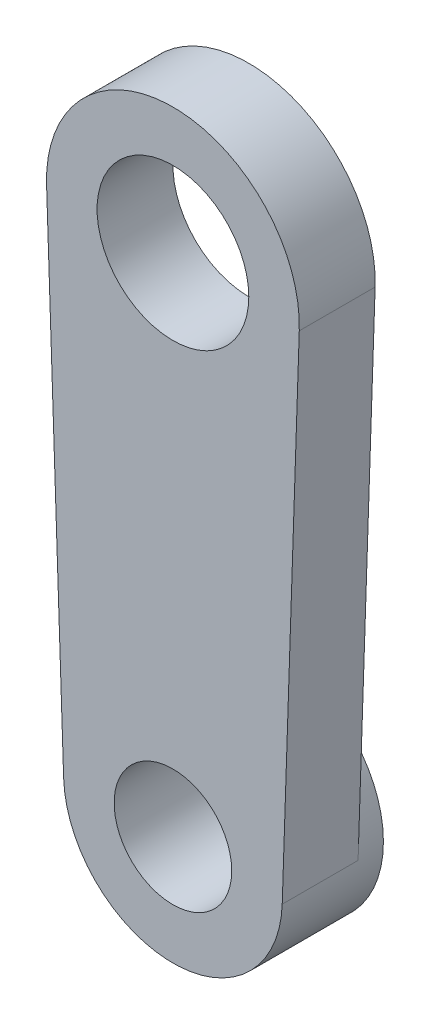
ISO-10303-21;
HEADER;
FILE_DESCRIPTION(('STEP AP214'),'2;1');
FILE_NAME('part.step','',(''),(''),'','','');
FILE_SCHEMA(('AUTOMOTIVE_DESIGN { 1 0 10303 214 1 1 1 1 }'));
ENDSEC;
DATA;
#1=APPLICATION_CONTEXT('core data for automotive mechanical design processes');
#2=APPLICATION_PROTOCOL_DEFINITION('international standard','automotive_design',2000,#1);
#3=PRODUCT_CONTEXT('',#1,'mechanical');
#4=PRODUCT('Part','Part','',(#3));
#5=PRODUCT_RELATED_PRODUCT_CATEGORY('part','',(#4));
#6=PRODUCT_DEFINITION_FORMATION('','',#4);
#7=PRODUCT_DEFINITION_CONTEXT('part definition',#1,'design');
#8=PRODUCT_DEFINITION('design','',#6,#7);
#9=PRODUCT_DEFINITION_SHAPE('','',#8);
#10=(LENGTH_UNIT() NAMED_UNIT(*) SI_UNIT(.MILLI.,.METRE.));
#11=(NAMED_UNIT(*) PLANE_ANGLE_UNIT() SI_UNIT($,.RADIAN.));
#12=(NAMED_UNIT(*) SI_UNIT($,.STERADIAN.) SOLID_ANGLE_UNIT());
#13=UNCERTAINTY_MEASURE_WITH_UNIT(LENGTH_MEASURE(1.E-05),#10,'distance_accuracy_value','');
#14=(GEOMETRIC_REPRESENTATION_CONTEXT(3) GLOBAL_UNCERTAINTY_ASSIGNED_CONTEXT((#13)) GLOBAL_UNIT_ASSIGNED_CONTEXT((#10,
#11,#12)) REPRESENTATION_CONTEXT('',''));
#15=CARTESIAN_POINT('',(0.,0.,0.));
#16=DIRECTION('',(0.,0.,1.));
#17=DIRECTION('',(1.,0.,0.));
#18=AXIS2_PLACEMENT_3D('',#15,#16,#17);
#19=CARTESIAN_POINT('',(0.,0.,3.));
#20=DIRECTION('',(0.,0.,-1.));
#21=DIRECTION('',(-1.,0.,0.));
#22=AXIS2_PLACEMENT_3D('',#19,#20,#21);
#23=CYLINDRICAL_SURFACE('',#22,4.325);
#24=DIRECTION('',(0.,0.,-1.));
#25=VECTOR('',#24,1.);
#26=CARTESIAN_POINT('',(-4.32253607550283,-0.14596875,3.));
#27=LINE('',#26,#25);
#28=CARTESIAN_POINT('',(-4.32253607550283,-0.14596875,3.));
#29=VERTEX_POINT('',#28);
#30=CARTESIAN_POINT('',(-4.32253607550283,-0.14596875,0.));
#31=VERTEX_POINT('',#30);
#32=EDGE_CURVE('E100',#29,#31,#27,.T.);
#33=ORIENTED_EDGE('',*,*,#32,.T.);
#34=CARTESIAN_POINT('',(0.,0.,0.));
#35=DIRECTION('',(0.,0.,1.));
#36=DIRECTION('',(1.,0.,0.));
#37=AXIS2_PLACEMENT_3D('',#34,#35,#36);
#38=CIRCLE('',#37,4.325);
#39=CARTESIAN_POINT('',(4.32253607550283,-0.14596875,0.));
#40=VERTEX_POINT('',#39);
#41=EDGE_CURVE('E11',#40,#31,#38,.T.);
#42=ORIENTED_EDGE('',*,*,#41,.F.);
#43=DIRECTION('',(0.,0.,-1.));
#44=VECTOR('',#43,1.);
#45=CARTESIAN_POINT('',(4.32253607550283,-0.14596875,3.));
#46=LINE('',#45,#44);
#47=CARTESIAN_POINT('',(4.32253607550283,-0.14596875,3.));
#48=VERTEX_POINT('',#47);
#49=EDGE_CURVE('E51',#48,#40,#46,.T.);
#50=ORIENTED_EDGE('',*,*,#49,.F.);
#51=CARTESIAN_POINT('',(0.,0.,3.));
#52=DIRECTION('',(0.,0.,1.));
#53=DIRECTION('',(1.,0.,0.));
#54=AXIS2_PLACEMENT_3D('',#51,#52,#53);
#55=CIRCLE('',#54,4.325);
#56=EDGE_CURVE('E91',#29,#48,#55,.T.);
#57=ORIENTED_EDGE('',*,*,#56,.F.);
#58=EDGE_LOOP('',(#33,#42,#50,#57));
#59=FACE_BOUND('',#58,.T.);
#60=CARTESIAN_POINT('',(0.,0.,-1.));
#61=DIRECTION('',(0.,0.,1.));
#62=DIRECTION('',(1.,0.,0.));
#63=AXIS2_PLACEMENT_3D('',#60,#61,#62);
#64=CIRCLE('',#63,4.325);
#65=CARTESIAN_POINT('',(4.325,0.,-1.));
#66=VERTEX_POINT('',#65);
#67=EDGE_CURVE('E117',#66,#66,#64,.T.);
#68=ORIENTED_EDGE('',*,*,#67,.T.);
#69=EDGE_LOOP('',(#68));
#70=FACE_BOUND('',#69,.T.);
#71=ADVANCED_FACE('F47',(#59,#70),#23,.T.);
#72=CARTESIAN_POINT('',(4.32253607550283,-0.14596875,3.));
#73=DIRECTION('',(0.999430306474644,-0.03375,0.));
#74=DIRECTION('',(0.03375,0.999430306474644,0.));
#75=AXIS2_PLACEMENT_3D('',#72,#73,#74);
#76=PLANE('',#75);
#77=DIRECTION('',(-0.03375,-0.999430306474644,0.));
#78=VECTOR('',#77,1.);
#79=CARTESIAN_POINT('',(4.32253607550283,-0.14596875,0.));
#80=LINE('',#79,#78);
#81=CARTESIAN_POINT('',(4.99715153237322,19.83125,0.));
#82=VERTEX_POINT('',#81);
#83=EDGE_CURVE('E104',#82,#40,#80,.T.);
#84=ORIENTED_EDGE('',*,*,#83,.F.);
#85=DIRECTION('',(0.,0.,-1.));
#86=VECTOR('',#85,1.);
#87=CARTESIAN_POINT('',(4.99715153237322,19.83125,3.));
#88=LINE('',#87,#86);
#89=CARTESIAN_POINT('',(4.99715153237322,19.83125,3.));
#90=VERTEX_POINT('',#89);
#91=EDGE_CURVE('E107',#90,#82,#88,.T.);
#92=ORIENTED_EDGE('',*,*,#91,.F.);
#93=DIRECTION('',(-0.03375,-0.999430306474644,0.));
#94=VECTOR('',#93,1.);
#95=CARTESIAN_POINT('',(4.32253607550283,-0.14596875,3.));
#96=LINE('',#95,#94);
#97=EDGE_CURVE('E105',#90,#48,#96,.T.);
#98=ORIENTED_EDGE('',*,*,#97,.T.);
#99=ORIENTED_EDGE('',*,*,#49,.T.);
#100=EDGE_LOOP('',(#84,#92,#98,#99));
#101=FACE_BOUND('',#100,.T.);
#102=ADVANCED_FACE('F103',(#101),#76,.T.);
#103=CARTESIAN_POINT('',(0.,20.,3.));
#104=DIRECTION('',(0.,0.,-1.));
#105=DIRECTION('',(-1.,0.,0.));
#106=AXIS2_PLACEMENT_3D('',#103,#104,#105);
#107=CYLINDRICAL_SURFACE('',#106,5.);
#108=CARTESIAN_POINT('',(0.,20.,0.));
#109=DIRECTION('',(0.,0.,1.));
#110=DIRECTION('',(1.,0.,0.));
#111=AXIS2_PLACEMENT_3D('',#108,#109,#110);
#112=CIRCLE('',#111,5.);
#113=CARTESIAN_POINT('',(-4.99715153237322,19.83125,0.));
#114=VERTEX_POINT('',#113);
#115=EDGE_CURVE('E80',#82,#114,#112,.T.);
#116=ORIENTED_EDGE('',*,*,#115,.T.);
#117=DIRECTION('',(0.,0.,-1.));
#118=VECTOR('',#117,1.);
#119=CARTESIAN_POINT('',(-4.99715153237322,19.83125,3.));
#120=LINE('',#119,#118);
#121=CARTESIAN_POINT('',(-4.99715153237322,19.83125,3.));
#122=VERTEX_POINT('',#121);
#123=EDGE_CURVE('E126',#122,#114,#120,.T.);
#124=ORIENTED_EDGE('',*,*,#123,.F.);
#125=CARTESIAN_POINT('',(0.,20.,3.));
#126=DIRECTION('',(0.,0.,1.));
#127=DIRECTION('',(1.,0.,0.));
#128=AXIS2_PLACEMENT_3D('',#125,#126,#127);
#129=CIRCLE('',#128,5.);
#130=EDGE_CURVE('E131',#90,#122,#129,.T.);
#131=ORIENTED_EDGE('',*,*,#130,.F.);
#132=ORIENTED_EDGE('',*,*,#91,.T.);
#133=EDGE_LOOP('',(#116,#124,#131,#132));
#134=FACE_BOUND('',#133,.T.);
#135=ADVANCED_FACE('F130',(#134),#107,.T.);
#136=CARTESIAN_POINT('',(0.,0.,3.));
#137=DIRECTION('',(0.,0.,-1.));
#138=DIRECTION('',(-1.,0.,0.));
#139=AXIS2_PLACEMENT_3D('',#136,#137,#138);
#140=CYLINDRICAL_SURFACE('',#139,2.325);
#141=CARTESIAN_POINT('',(0.,0.,3.));
#142=DIRECTION('',(0.,0.,1.));
#143=DIRECTION('',(1.,0.,0.));
#144=AXIS2_PLACEMENT_3D('',#141,#142,#143);
#145=CIRCLE('',#144,2.325);
#146=CARTESIAN_POINT('',(2.325,0.,3.));
#147=VERTEX_POINT('',#146);
#148=EDGE_CURVE('E138',#147,#147,#145,.T.);
#149=ORIENTED_EDGE('',*,*,#148,.T.);
#150=EDGE_LOOP('',(#149));
#151=FACE_BOUND('',#150,.T.);
#152=CARTESIAN_POINT('',(0.,0.,-1.));
#153=DIRECTION('',(0.,0.,1.));
#154=DIRECTION('',(1.,0.,0.));
#155=AXIS2_PLACEMENT_3D('',#152,#153,#154);
#156=CIRCLE('',#155,2.325);
#157=CARTESIAN_POINT('',(2.325,0.,-1.));
#158=VERTEX_POINT('',#157);
#159=EDGE_CURVE('E151',#158,#158,#156,.T.);
#160=ORIENTED_EDGE('',*,*,#159,.F.);
#161=EDGE_LOOP('',(#160));
#162=FACE_BOUND('',#161,.T.);
#163=ADVANCED_FACE('F159',(#151,#162),#140,.F.);
#164=CARTESIAN_POINT('',(0.,20.,3.));
#165=DIRECTION('',(0.,0.,-1.));
#166=DIRECTION('',(-1.,0.,0.));
#167=AXIS2_PLACEMENT_3D('',#164,#165,#166);
#168=CYLINDRICAL_SURFACE('',#167,3.);
#169=CARTESIAN_POINT('',(0.,20.,3.));
#170=DIRECTION('',(0.,0.,1.));
#171=DIRECTION('',(1.,0.,0.));
#172=AXIS2_PLACEMENT_3D('',#169,#170,#171);
#173=CIRCLE('',#172,3.);
#174=CARTESIAN_POINT('',(3.,20.,3.));
#175=VERTEX_POINT('',#174);
#176=EDGE_CURVE('E123',#175,#175,#173,.T.);
#177=ORIENTED_EDGE('',*,*,#176,.T.);
#178=EDGE_LOOP('',(#177));
#179=FACE_BOUND('',#178,.T.);
#180=CARTESIAN_POINT('',(0.,20.,0.));
#181=DIRECTION('',(0.,0.,1.));
#182=DIRECTION('',(1.,0.,0.));
#183=AXIS2_PLACEMENT_3D('',#180,#181,#182);
#184=CIRCLE('',#183,3.);
#185=CARTESIAN_POINT('',(3.,20.,0.));
#186=VERTEX_POINT('',#185);
#187=EDGE_CURVE('E110',#186,#186,#184,.T.);
#188=ORIENTED_EDGE('',*,*,#187,.F.);
#189=EDGE_LOOP('',(#188));
#190=FACE_BOUND('',#189,.T.);
#191=ADVANCED_FACE('F49',(#179,#190),#168,.F.);
#192=CARTESIAN_POINT('',(-4.32253607550283,-0.14596875,3.));
#193=DIRECTION('',(0.999430306474644,0.03375,0.));
#194=DIRECTION('',(-0.03375,0.999430306474644,0.));
#195=AXIS2_PLACEMENT_3D('',#192,#193,#194);
#196=PLANE('',#195);
#197=DIRECTION('',(0.03375,-0.999430306474644,0.));
#198=VECTOR('',#197,1.);
#199=CARTESIAN_POINT('',(-4.32253607550283,-0.14596875,0.));
#200=LINE('',#199,#198);
#201=EDGE_CURVE('E114',#114,#31,#200,.T.);
#202=ORIENTED_EDGE('',*,*,#201,.T.);
#203=ORIENTED_EDGE('',*,*,#32,.F.);
#204=DIRECTION('',(0.03375,-0.999430306474644,0.));
#205=VECTOR('',#204,1.);
#206=CARTESIAN_POINT('',(-4.32253607550283,-0.14596875,3.));
#207=LINE('',#206,#205);
#208=EDGE_CURVE('E66',#122,#29,#207,.T.);
#209=ORIENTED_EDGE('',*,*,#208,.F.);
#210=ORIENTED_EDGE('',*,*,#123,.T.);
#211=EDGE_LOOP('',(#202,#203,#209,#210));
#212=FACE_BOUND('',#211,.T.);
#213=ADVANCED_FACE('F167',(#212),#196,.F.);
#214=CARTESIAN_POINT('',(0.,0.,3.));
#215=DIRECTION('',(0.,0.,1.));
#216=DIRECTION('',(1.,0.,0.));
#217=AXIS2_PLACEMENT_3D('',#214,#215,#216);
#218=PLANE('',#217);
#219=ORIENTED_EDGE('',*,*,#176,.F.);
#220=EDGE_LOOP('',(#219));
#221=FACE_BOUND('',#220,.T.);
#222=ORIENTED_EDGE('',*,*,#148,.F.);
#223=EDGE_LOOP('',(#222));
#224=FACE_BOUND('',#223,.T.);
#225=ORIENTED_EDGE('',*,*,#56,.T.);
#226=ORIENTED_EDGE('',*,*,#97,.F.);
#227=ORIENTED_EDGE('',*,*,#130,.T.);
#228=ORIENTED_EDGE('',*,*,#208,.T.);
#229=EDGE_LOOP('',(#225,#226,#227,#228));
#230=FACE_BOUND('',#229,.T.);
#231=ADVANCED_FACE('F134',(#221,#224,#230),#218,.T.);
#232=CARTESIAN_POINT('',(0.,0.,0.));
#233=DIRECTION('',(0.,0.,1.));
#234=DIRECTION('',(1.,0.,0.));
#235=AXIS2_PLACEMENT_3D('',#232,#233,#234);
#236=PLANE('',#235);
#237=ORIENTED_EDGE('',*,*,#187,.T.);
#238=EDGE_LOOP('',(#237));
#239=FACE_BOUND('',#238,.T.);
#240=ORIENTED_EDGE('',*,*,#83,.T.);
#241=ORIENTED_EDGE('',*,*,#41,.T.);
#242=ORIENTED_EDGE('',*,*,#201,.F.);
#243=ORIENTED_EDGE('',*,*,#115,.F.);
#244=EDGE_LOOP('',(#240,#241,#242,#243));
#245=FACE_BOUND('',#244,.T.);
#246=ADVANCED_FACE('F108',(#239,#245),#236,.F.);
#247=CARTESIAN_POINT('',(0.,0.,-1.));
#248=DIRECTION('',(0.,0.,1.));
#249=DIRECTION('',(1.,0.,0.));
#250=AXIS2_PLACEMENT_3D('',#247,#248,#249);
#251=PLANE('',#250);
#252=ORIENTED_EDGE('',*,*,#159,.T.);
#253=EDGE_LOOP('',(#252));
#254=FACE_BOUND('',#253,.T.);
#255=ORIENTED_EDGE('',*,*,#67,.F.);
#256=EDGE_LOOP('',(#255));
#257=FACE_BOUND('',#256,.T.);
#258=ADVANCED_FACE('F156',(#254,#257),#251,.F.);
#259=CLOSED_SHELL('',(#71,#102,#135,#163,#191,#213,#231,#246,#258));
#260=MANIFOLD_SOLID_BREP('B2',#259);
#261=ADVANCED_BREP_SHAPE_REPRESENTATION('',(#18,#260),#14);
#262=SHAPE_DEFINITION_REPRESENTATION(#9,#261);
ENDSEC;
END-ISO-10303-21;
